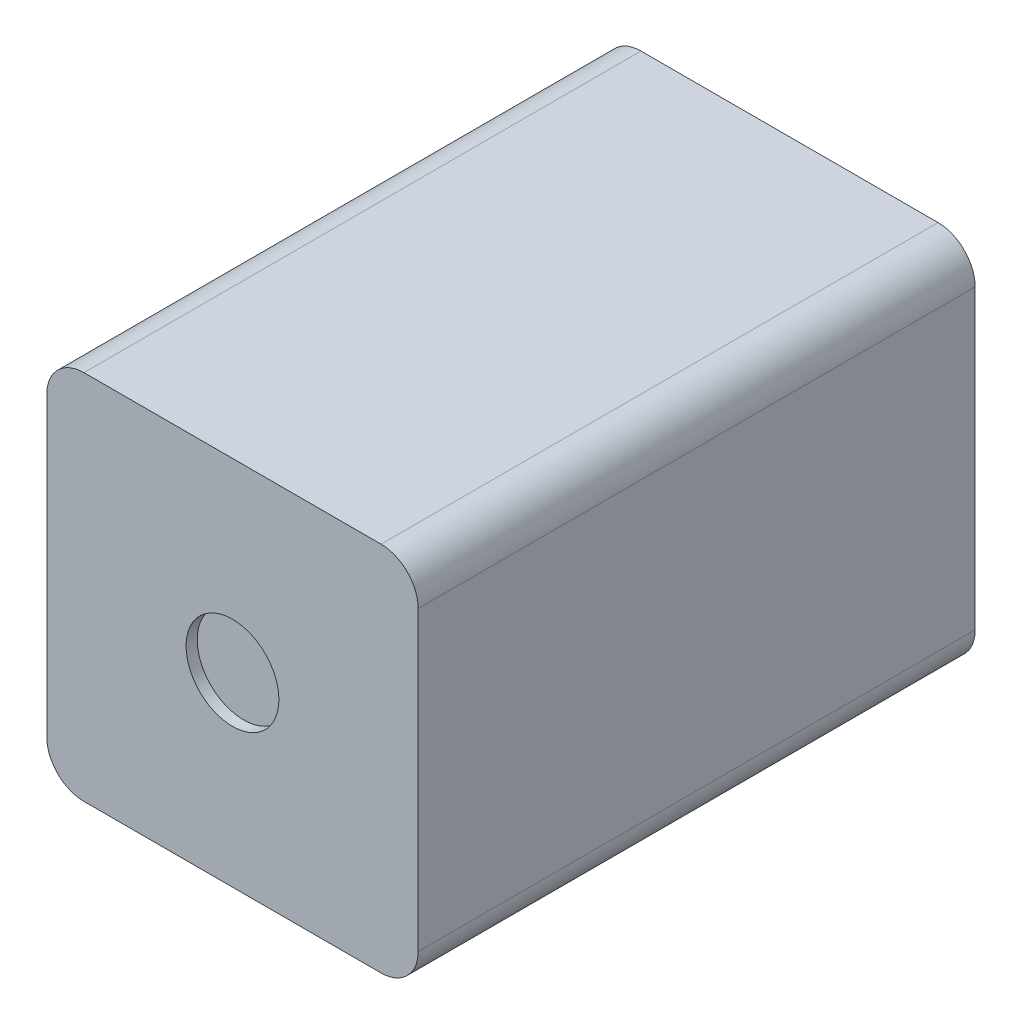
ISO-10303-21;
HEADER;
FILE_DESCRIPTION(('STEP AP214'),'2;1');
FILE_NAME('part.step','',(''),(''),'','','');
FILE_SCHEMA(('AUTOMOTIVE_DESIGN { 1 0 10303 214 1 1 1 1 }'));
ENDSEC;
DATA;
#1=APPLICATION_CONTEXT('core data for automotive mechanical design processes');
#2=APPLICATION_PROTOCOL_DEFINITION('international standard','automotive_design',2000,#1);
#3=PRODUCT_CONTEXT('',#1,'mechanical');
#4=PRODUCT('Part','Part','',(#3));
#5=PRODUCT_RELATED_PRODUCT_CATEGORY('part','',(#4));
#6=PRODUCT_DEFINITION_FORMATION('','',#4);
#7=PRODUCT_DEFINITION_CONTEXT('part definition',#1,'design');
#8=PRODUCT_DEFINITION('design','',#6,#7);
#9=PRODUCT_DEFINITION_SHAPE('','',#8);
#10=(LENGTH_UNIT() NAMED_UNIT(*) SI_UNIT(.MILLI.,.METRE.));
#11=(NAMED_UNIT(*) PLANE_ANGLE_UNIT() SI_UNIT($,.RADIAN.));
#12=(NAMED_UNIT(*) SI_UNIT($,.STERADIAN.) SOLID_ANGLE_UNIT());
#13=UNCERTAINTY_MEASURE_WITH_UNIT(LENGTH_MEASURE(1.E-05),#10,'distance_accuracy_value','');
#14=(GEOMETRIC_REPRESENTATION_CONTEXT(3) GLOBAL_UNCERTAINTY_ASSIGNED_CONTEXT((#13)) GLOBAL_UNIT_ASSIGNED_CONTEXT((#10,
#11,#12)) REPRESENTATION_CONTEXT('',''));
#15=CARTESIAN_POINT('',(0.,0.,0.));
#16=DIRECTION('',(0.,0.,1.));
#17=DIRECTION('',(1.,0.,0.));
#18=AXIS2_PLACEMENT_3D('',#15,#16,#17);
#19=CARTESIAN_POINT('',(0.,0.,38.1));
#20=DIRECTION('',(-1.,0.,0.));
#21=DIRECTION('',(0.,-1.,0.));
#22=AXIS2_PLACEMENT_3D('',#19,#20,#21);
#23=PLANE('',#22);
#24=DIRECTION('',(0.,1.,0.));
#25=VECTOR('',#24,1.);
#26=CARTESIAN_POINT('',(0.,0.,38.1));
#27=LINE('',#26,#25);
#28=CARTESIAN_POINT('',(0.,-22.86,38.1));
#29=VERTEX_POINT('',#28);
#30=CARTESIAN_POINT('',(0.,-2.54,38.1));
#31=VERTEX_POINT('',#30);
#32=EDGE_CURVE('E136',#29,#31,#27,.T.);
#33=ORIENTED_EDGE('',*,*,#32,.F.);
#34=DIRECTION('',(0.,0.,-1.));
#35=VECTOR('',#34,1.);
#36=CARTESIAN_POINT('',(0.,-22.86,38.1));
#37=LINE('',#36,#35);
#38=CARTESIAN_POINT('',(0.,-22.86,0.));
#39=VERTEX_POINT('',#38);
#40=EDGE_CURVE('E121',#29,#39,#37,.T.);
#41=ORIENTED_EDGE('',*,*,#40,.T.);
#42=DIRECTION('',(0.,1.,0.));
#43=VECTOR('',#42,1.);
#44=CARTESIAN_POINT('',(0.,0.,0.));
#45=LINE('',#44,#43);
#46=CARTESIAN_POINT('',(0.,-2.54,0.));
#47=VERTEX_POINT('',#46);
#48=EDGE_CURVE('E133',#39,#47,#45,.T.);
#49=ORIENTED_EDGE('',*,*,#48,.T.);
#50=DIRECTION('',(0.,0.,-1.));
#51=VECTOR('',#50,1.);
#52=CARTESIAN_POINT('',(0.,-2.54,38.1));
#53=LINE('',#52,#51);
#54=EDGE_CURVE('E138',#47,#31,#53,.F.);
#55=ORIENTED_EDGE('',*,*,#54,.T.);
#56=EDGE_LOOP('',(#33,#41,#49,#55));
#57=FACE_BOUND('',#56,.T.);
#58=ADVANCED_FACE('F42',(#57),#23,.F.);
#59=CARTESIAN_POINT('',(0.,0.,38.1));
#60=DIRECTION('',(0.,-1.,0.));
#61=DIRECTION('',(1.,0.,0.));
#62=AXIS2_PLACEMENT_3D('',#59,#60,#61);
#63=PLANE('',#62);
#64=DIRECTION('',(-1.,0.,0.));
#65=VECTOR('',#64,1.);
#66=CARTESIAN_POINT('',(0.,0.,38.1));
#67=LINE('',#66,#65);
#68=CARTESIAN_POINT('',(-2.54,0.,38.1));
#69=VERTEX_POINT('',#68);
#70=CARTESIAN_POINT('',(-22.86,0.,38.1));
#71=VERTEX_POINT('',#70);
#72=EDGE_CURVE('E192',#69,#71,#67,.T.);
#73=ORIENTED_EDGE('',*,*,#72,.F.);
#74=DIRECTION('',(0.,0.,-1.));
#75=VECTOR('',#74,1.);
#76=CARTESIAN_POINT('',(-2.54,0.,38.1));
#77=LINE('',#76,#75);
#78=CARTESIAN_POINT('',(-2.54,0.,0.));
#79=VERTEX_POINT('',#78);
#80=EDGE_CURVE('E11',#69,#79,#77,.T.);
#81=ORIENTED_EDGE('',*,*,#80,.T.);
#82=DIRECTION('',(-1.,0.,0.));
#83=VECTOR('',#82,1.);
#84=CARTESIAN_POINT('',(0.,0.,0.));
#85=LINE('',#84,#83);
#86=CARTESIAN_POINT('',(-22.86,0.,0.));
#87=VERTEX_POINT('',#86);
#88=EDGE_CURVE('E143',#79,#87,#85,.T.);
#89=ORIENTED_EDGE('',*,*,#88,.T.);
#90=DIRECTION('',(0.,0.,-1.));
#91=VECTOR('',#90,1.);
#92=CARTESIAN_POINT('',(-22.86,0.,38.1));
#93=LINE('',#92,#91);
#94=EDGE_CURVE('E50',#87,#71,#93,.F.);
#95=ORIENTED_EDGE('',*,*,#94,.T.);
#96=EDGE_LOOP('',(#73,#81,#89,#95));
#97=FACE_BOUND('',#96,.T.);
#98=ADVANCED_FACE('F191',(#97),#63,.F.);
#99=CARTESIAN_POINT('',(-25.4,0.,38.1));
#100=DIRECTION('',(1.,0.,0.));
#101=DIRECTION('',(0.,1.,0.));
#102=AXIS2_PLACEMENT_3D('',#99,#100,#101);
#103=PLANE('',#102);
#104=DIRECTION('',(0.,-1.,0.));
#105=VECTOR('',#104,1.);
#106=CARTESIAN_POINT('',(-25.4,0.,0.));
#107=LINE('',#106,#105);
#108=CARTESIAN_POINT('',(-25.4,-2.54,0.));
#109=VERTEX_POINT('',#108);
#110=CARTESIAN_POINT('',(-25.4,-22.86,0.));
#111=VERTEX_POINT('',#110);
#112=EDGE_CURVE('E148',#109,#111,#107,.T.);
#113=ORIENTED_EDGE('',*,*,#112,.T.);
#114=DIRECTION('',(0.,0.,-1.));
#115=VECTOR('',#114,1.);
#116=CARTESIAN_POINT('',(-25.4,-22.86,38.1));
#117=LINE('',#116,#115);
#118=CARTESIAN_POINT('',(-25.4,-22.86,38.1));
#119=VERTEX_POINT('',#118);
#120=EDGE_CURVE('E60',#111,#119,#117,.F.);
#121=ORIENTED_EDGE('',*,*,#120,.T.);
#122=DIRECTION('',(0.,-1.,0.));
#123=VECTOR('',#122,1.);
#124=CARTESIAN_POINT('',(-25.4,0.,38.1));
#125=LINE('',#124,#123);
#126=CARTESIAN_POINT('',(-25.4,-2.54,38.1));
#127=VERTEX_POINT('',#126);
#128=EDGE_CURVE('E199',#127,#119,#125,.T.);
#129=ORIENTED_EDGE('',*,*,#128,.F.);
#130=DIRECTION('',(0.,0.,-1.));
#131=VECTOR('',#130,1.);
#132=CARTESIAN_POINT('',(-25.4,-2.54,38.1));
#133=LINE('',#132,#131);
#134=EDGE_CURVE('E182',#127,#109,#133,.T.);
#135=ORIENTED_EDGE('',*,*,#134,.T.);
#136=EDGE_LOOP('',(#113,#121,#129,#135));
#137=FACE_BOUND('',#136,.T.);
#138=ADVANCED_FACE('F203',(#137),#103,.F.);
#139=CARTESIAN_POINT('',(0.,-25.4,38.1));
#140=DIRECTION('',(0.,1.,0.));
#141=DIRECTION('',(-1.,0.,0.));
#142=AXIS2_PLACEMENT_3D('',#139,#140,#141);
#143=PLANE('',#142);
#144=DIRECTION('',(1.,0.,0.));
#145=VECTOR('',#144,1.);
#146=CARTESIAN_POINT('',(0.,-25.4,0.));
#147=LINE('',#146,#145);
#148=CARTESIAN_POINT('',(-22.86,-25.4,0.));
#149=VERTEX_POINT('',#148);
#150=CARTESIAN_POINT('',(-2.54,-25.4,0.));
#151=VERTEX_POINT('',#150);
#152=EDGE_CURVE('E160',#149,#151,#147,.T.);
#153=ORIENTED_EDGE('',*,*,#152,.T.);
#154=DIRECTION('',(0.,0.,-1.));
#155=VECTOR('',#154,1.);
#156=CARTESIAN_POINT('',(-2.54,-25.4,38.1));
#157=LINE('',#156,#155);
#158=CARTESIAN_POINT('',(-2.54,-25.4,38.1));
#159=VERTEX_POINT('',#158);
#160=EDGE_CURVE('E122',#151,#159,#157,.F.);
#161=ORIENTED_EDGE('',*,*,#160,.T.);
#162=DIRECTION('',(1.,0.,0.));
#163=VECTOR('',#162,1.);
#164=CARTESIAN_POINT('',(0.,-25.4,38.1));
#165=LINE('',#164,#163);
#166=CARTESIAN_POINT('',(-22.86,-25.4,38.1));
#167=VERTEX_POINT('',#166);
#168=EDGE_CURVE('E155',#167,#159,#165,.T.);
#169=ORIENTED_EDGE('',*,*,#168,.F.);
#170=DIRECTION('',(0.,0.,-1.));
#171=VECTOR('',#170,1.);
#172=CARTESIAN_POINT('',(-22.86,-25.4,38.1));
#173=LINE('',#172,#171);
#174=EDGE_CURVE('E127',#167,#149,#173,.T.);
#175=ORIENTED_EDGE('',*,*,#174,.T.);
#176=EDGE_LOOP('',(#153,#161,#169,#175));
#177=FACE_BOUND('',#176,.T.);
#178=ADVANCED_FACE('F210',(#177),#143,.F.);
#179=CARTESIAN_POINT('',(0.,0.,38.1));
#180=DIRECTION('',(0.,0.,-1.));
#181=DIRECTION('',(-1.,0.,0.));
#182=AXIS2_PLACEMENT_3D('',#179,#180,#181);
#183=PLANE('',#182);
#184=CARTESIAN_POINT('',(-12.7,-12.7,38.1));
#185=DIRECTION('',(0.,0.,1.));
#186=DIRECTION('',(1.,0.,0.));
#187=AXIS2_PLACEMENT_3D('',#184,#185,#186);
#188=CIRCLE('',#187,3.175);
#189=CARTESIAN_POINT('',(-9.525,-12.7,38.1));
#190=VERTEX_POINT('',#189);
#191=EDGE_CURVE('E152',#190,#190,#188,.T.);
#192=ORIENTED_EDGE('',*,*,#191,.F.);
#193=EDGE_LOOP('',(#192));
#194=FACE_BOUND('',#193,.T.);
#195=ORIENTED_EDGE('',*,*,#168,.T.);
#196=CARTESIAN_POINT('',(-2.54,-22.86,38.1));
#197=DIRECTION('',(0.,0.,-1.));
#198=DIRECTION('',(-1.,0.,0.));
#199=AXIS2_PLACEMENT_3D('',#196,#197,#198);
#200=CIRCLE('',#199,2.54);
#201=EDGE_CURVE('E180',#159,#29,#200,.F.);
#202=ORIENTED_EDGE('',*,*,#201,.T.);
#203=ORIENTED_EDGE('',*,*,#32,.T.);
#204=CARTESIAN_POINT('',(-2.54,-2.54,38.1));
#205=DIRECTION('',(0.,0.,-1.));
#206=DIRECTION('',(-1.,0.,0.));
#207=AXIS2_PLACEMENT_3D('',#204,#205,#206);
#208=CIRCLE('',#207,2.54);
#209=EDGE_CURVE('E175',#31,#69,#208,.F.);
#210=ORIENTED_EDGE('',*,*,#209,.T.);
#211=ORIENTED_EDGE('',*,*,#72,.T.);
#212=CARTESIAN_POINT('',(-22.86,-2.54,38.1));
#213=DIRECTION('',(0.,0.,-1.));
#214=DIRECTION('',(-1.,0.,0.));
#215=AXIS2_PLACEMENT_3D('',#212,#213,#214);
#216=CIRCLE('',#215,2.54);
#217=EDGE_CURVE('E68',#71,#127,#216,.F.);
#218=ORIENTED_EDGE('',*,*,#217,.T.);
#219=ORIENTED_EDGE('',*,*,#128,.T.);
#220=CARTESIAN_POINT('',(-22.86,-22.86,38.1));
#221=DIRECTION('',(0.,0.,-1.));
#222=DIRECTION('',(-1.,0.,0.));
#223=AXIS2_PLACEMENT_3D('',#220,#221,#222);
#224=CIRCLE('',#223,2.54);
#225=EDGE_CURVE('E177',#119,#167,#224,.F.);
#226=ORIENTED_EDGE('',*,*,#225,.T.);
#227=EDGE_LOOP('',(#195,#202,#203,#210,#211,#218,#219,#226));
#228=FACE_BOUND('',#227,.T.);
#229=ADVANCED_FACE('F196',(#194,#228),#183,.F.);
#230=CARTESIAN_POINT('',(0.,0.,0.));
#231=DIRECTION('',(0.,0.,-1.));
#232=DIRECTION('',(-1.,0.,0.));
#233=AXIS2_PLACEMENT_3D('',#230,#231,#232);
#234=PLANE('',#233);
#235=CARTESIAN_POINT('',(-12.7,-12.7,0.));
#236=DIRECTION('',(0.,0.,-1.));
#237=DIRECTION('',(-1.,0.,0.));
#238=AXIS2_PLACEMENT_3D('',#235,#236,#237);
#239=CIRCLE('',#238,3.175);
#240=CARTESIAN_POINT('',(-15.875,-12.7,0.));
#241=VERTEX_POINT('',#240);
#242=EDGE_CURVE('E219',#241,#241,#239,.T.);
#243=ORIENTED_EDGE('',*,*,#242,.F.);
#244=EDGE_LOOP('',(#243));
#245=FACE_BOUND('',#244,.T.);
#246=ORIENTED_EDGE('',*,*,#48,.F.);
#247=CARTESIAN_POINT('',(-2.54,-22.86,0.));
#248=DIRECTION('',(0.,0.,-1.));
#249=DIRECTION('',(-1.,0.,0.));
#250=AXIS2_PLACEMENT_3D('',#247,#248,#249);
#251=CIRCLE('',#250,2.54);
#252=EDGE_CURVE('E117',#39,#151,#251,.T.);
#253=ORIENTED_EDGE('',*,*,#252,.T.);
#254=ORIENTED_EDGE('',*,*,#152,.F.);
#255=CARTESIAN_POINT('',(-22.86,-22.86,0.));
#256=DIRECTION('',(0.,0.,-1.));
#257=DIRECTION('',(-1.,0.,0.));
#258=AXIS2_PLACEMENT_3D('',#255,#256,#257);
#259=CIRCLE('',#258,2.54);
#260=EDGE_CURVE('E128',#149,#111,#259,.T.);
#261=ORIENTED_EDGE('',*,*,#260,.T.);
#262=ORIENTED_EDGE('',*,*,#112,.F.);
#263=CARTESIAN_POINT('',(-22.86,-2.54,0.));
#264=DIRECTION('',(0.,0.,-1.));
#265=DIRECTION('',(-1.,0.,0.));
#266=AXIS2_PLACEMENT_3D('',#263,#264,#265);
#267=CIRCLE('',#266,2.54);
#268=EDGE_CURVE('E137',#109,#87,#267,.T.);
#269=ORIENTED_EDGE('',*,*,#268,.T.);
#270=ORIENTED_EDGE('',*,*,#88,.F.);
#271=CARTESIAN_POINT('',(-2.54,-2.54,0.));
#272=DIRECTION('',(0.,0.,-1.));
#273=DIRECTION('',(-1.,0.,0.));
#274=AXIS2_PLACEMENT_3D('',#271,#272,#273);
#275=CIRCLE('',#274,2.54);
#276=EDGE_CURVE('E142',#79,#47,#275,.T.);
#277=ORIENTED_EDGE('',*,*,#276,.T.);
#278=EDGE_LOOP('',(#246,#253,#254,#261,#262,#269,#270,#277));
#279=FACE_BOUND('',#278,.T.);
#280=ADVANCED_FACE('F140',(#245,#279),#234,.T.);
#281=CARTESIAN_POINT('',(-2.54,-22.86,38.1));
#282=DIRECTION('',(0.,0.,-1.));
#283=DIRECTION('',(-1.,0.,0.));
#284=AXIS2_PLACEMENT_3D('',#281,#282,#283);
#285=CYLINDRICAL_SURFACE('',#284,2.54);
#286=ORIENTED_EDGE('',*,*,#201,.F.);
#287=ORIENTED_EDGE('',*,*,#160,.F.);
#288=ORIENTED_EDGE('',*,*,#252,.F.);
#289=ORIENTED_EDGE('',*,*,#40,.F.);
#290=EDGE_LOOP('',(#286,#287,#288,#289));
#291=FACE_BOUND('',#290,.T.);
#292=ADVANCED_FACE('F120',(#291),#285,.T.);
#293=CARTESIAN_POINT('',(-22.86,-22.86,38.1));
#294=DIRECTION('',(0.,0.,-1.));
#295=DIRECTION('',(-1.,0.,0.));
#296=AXIS2_PLACEMENT_3D('',#293,#294,#295);
#297=CYLINDRICAL_SURFACE('',#296,2.54);
#298=ORIENTED_EDGE('',*,*,#225,.F.);
#299=ORIENTED_EDGE('',*,*,#120,.F.);
#300=ORIENTED_EDGE('',*,*,#260,.F.);
#301=ORIENTED_EDGE('',*,*,#174,.F.);
#302=EDGE_LOOP('',(#298,#299,#300,#301));
#303=FACE_BOUND('',#302,.T.);
#304=ADVANCED_FACE('F207',(#303),#297,.T.);
#305=CARTESIAN_POINT('',(-2.54,-2.54,38.1));
#306=DIRECTION('',(0.,0.,-1.));
#307=DIRECTION('',(-1.,0.,0.));
#308=AXIS2_PLACEMENT_3D('',#305,#306,#307);
#309=CYLINDRICAL_SURFACE('',#308,2.54);
#310=ORIENTED_EDGE('',*,*,#209,.F.);
#311=ORIENTED_EDGE('',*,*,#54,.F.);
#312=ORIENTED_EDGE('',*,*,#276,.F.);
#313=ORIENTED_EDGE('',*,*,#80,.F.);
#314=EDGE_LOOP('',(#310,#311,#312,#313));
#315=FACE_BOUND('',#314,.T.);
#316=ADVANCED_FACE('F255',(#315),#309,.T.);
#317=CARTESIAN_POINT('',(-22.86,-2.54,38.1));
#318=DIRECTION('',(0.,0.,-1.));
#319=DIRECTION('',(-1.,0.,0.));
#320=AXIS2_PLACEMENT_3D('',#317,#318,#319);
#321=CYLINDRICAL_SURFACE('',#320,2.54);
#322=ORIENTED_EDGE('',*,*,#217,.F.);
#323=ORIENTED_EDGE('',*,*,#94,.F.);
#324=ORIENTED_EDGE('',*,*,#268,.F.);
#325=ORIENTED_EDGE('',*,*,#134,.F.);
#326=EDGE_LOOP('',(#322,#323,#324,#325));
#327=FACE_BOUND('',#326,.T.);
#328=ADVANCED_FACE('F44',(#327),#321,.T.);
#329=CARTESIAN_POINT('',(-12.7,-12.7,37.338));
#330=DIRECTION('',(0.,0.,1.));
#331=DIRECTION('',(1.,0.,0.));
#332=AXIS2_PLACEMENT_3D('',#329,#330,#331);
#333=CYLINDRICAL_SURFACE('',#332,3.175);
#334=CARTESIAN_POINT('',(-12.7,-12.7,37.338));
#335=DIRECTION('',(0.,0.,1.));
#336=DIRECTION('',(1.,0.,0.));
#337=AXIS2_PLACEMENT_3D('',#334,#335,#336);
#338=CIRCLE('',#337,3.175);
#339=CARTESIAN_POINT('',(-9.525,-12.7,37.338));
#340=VERTEX_POINT('',#339);
#341=EDGE_CURVE('E144',#340,#340,#338,.T.);
#342=CARTESIAN_POINT('',(-9.525,-12.7,37.338));
#343=CARTESIAN_POINT('',(-9.525,-12.7,37.3459375));
#344=CARTESIAN_POINT('',(-9.525,-12.7,37.353875));
#345=CARTESIAN_POINT('',(-9.525,-12.7,37.36975));
#346=CARTESIAN_POINT('',(-9.525,-12.7,37.3776875));
#347=CARTESIAN_POINT('',(-9.525,-12.7,37.3935625));
#348=CARTESIAN_POINT('',(-9.525,-12.7,37.4015));
#349=CARTESIAN_POINT('',(-9.525,-12.7,37.417375));
#350=CARTESIAN_POINT('',(-9.525,-12.7,37.4253125));
#351=CARTESIAN_POINT('',(-9.525,-12.7,37.4411875));
#352=CARTESIAN_POINT('',(-9.525,-12.7,37.449125));
#353=CARTESIAN_POINT('',(-9.525,-12.7,37.465));
#354=CARTESIAN_POINT('',(-9.525,-12.7,37.4729375));
#355=CARTESIAN_POINT('',(-9.525,-12.7,37.4888125));
#356=CARTESIAN_POINT('',(-9.525,-12.7,37.49675));
#357=CARTESIAN_POINT('',(-9.525,-12.7,37.512625));
#358=CARTESIAN_POINT('',(-9.525,-12.7,37.5205625));
#359=CARTESIAN_POINT('',(-9.525,-12.7,37.5364375));
#360=CARTESIAN_POINT('',(-9.525,-12.7,37.544375));
#361=CARTESIAN_POINT('',(-9.525,-12.7,37.56025));
#362=CARTESIAN_POINT('',(-9.525,-12.7,37.5681875));
#363=CARTESIAN_POINT('',(-9.525,-12.7,37.5840625));
#364=CARTESIAN_POINT('',(-9.525,-12.7,37.592));
#365=CARTESIAN_POINT('',(-9.525,-12.7,37.607875));
#366=CARTESIAN_POINT('',(-9.525,-12.7,37.6158125));
#367=CARTESIAN_POINT('',(-9.525,-12.7,37.6316875));
#368=CARTESIAN_POINT('',(-9.525,-12.7,37.639625));
#369=CARTESIAN_POINT('',(-9.525,-12.7,37.6555));
#370=CARTESIAN_POINT('',(-9.525,-12.7,37.6634375));
#371=CARTESIAN_POINT('',(-9.525,-12.7,37.6793125));
#372=CARTESIAN_POINT('',(-9.525,-12.7,37.68725));
#373=CARTESIAN_POINT('',(-9.525,-12.7,37.703125));
#374=CARTESIAN_POINT('',(-9.525,-12.7,37.7110625));
#375=CARTESIAN_POINT('',(-9.525,-12.7,37.7269375));
#376=CARTESIAN_POINT('',(-9.525,-12.7,37.734875));
#377=CARTESIAN_POINT('',(-9.525,-12.7,37.75075));
#378=CARTESIAN_POINT('',(-9.525,-12.7,37.7586875));
#379=CARTESIAN_POINT('',(-9.525,-12.7,37.7745625));
#380=CARTESIAN_POINT('',(-9.525,-12.7,37.7825));
#381=CARTESIAN_POINT('',(-9.525,-12.7,37.798375));
#382=CARTESIAN_POINT('',(-9.525,-12.7,37.8063125));
#383=CARTESIAN_POINT('',(-9.525,-12.7,37.8221875));
#384=CARTESIAN_POINT('',(-9.525,-12.7,37.830125));
#385=CARTESIAN_POINT('',(-9.525,-12.7,37.846));
#386=CARTESIAN_POINT('',(-9.525,-12.7,37.8539375));
#387=CARTESIAN_POINT('',(-9.525,-12.7,37.8698125));
#388=CARTESIAN_POINT('',(-9.525,-12.7,37.87775));
#389=CARTESIAN_POINT('',(-9.525,-12.7,37.893625));
#390=CARTESIAN_POINT('',(-9.525,-12.7,37.9015625));
#391=CARTESIAN_POINT('',(-9.525,-12.7,37.9174375));
#392=CARTESIAN_POINT('',(-9.525,-12.7,37.925375));
#393=CARTESIAN_POINT('',(-9.525,-12.7,37.94125));
#394=CARTESIAN_POINT('',(-9.525,-12.7,37.9491875));
#395=CARTESIAN_POINT('',(-9.525,-12.7,37.9650625));
#396=CARTESIAN_POINT('',(-9.525,-12.7,37.973));
#397=CARTESIAN_POINT('',(-9.525,-12.7,37.988875));
#398=CARTESIAN_POINT('',(-9.525,-12.7,37.9968125));
#399=CARTESIAN_POINT('',(-9.525,-12.7,38.0126875));
#400=CARTESIAN_POINT('',(-9.525,-12.7,38.020625));
#401=CARTESIAN_POINT('',(-9.525,-12.7,38.0365));
#402=CARTESIAN_POINT('',(-9.525,-12.7,38.0444375));
#403=CARTESIAN_POINT('',(-9.525,-12.7,38.0603125));
#404=CARTESIAN_POINT('',(-9.525,-12.7,38.06825));
#405=CARTESIAN_POINT('',(-9.525,-12.7,38.084125));
#406=CARTESIAN_POINT('',(-9.525,-12.7,38.0920625));
#407=CARTESIAN_POINT('',(-9.525,-12.7,38.1));
#408=B_SPLINE_CURVE_WITH_KNOTS('',3,(#342,#343,#344,#345,#346,#347,#348,#349,#350,#351,#352,
#353,#354,#355,#356,#357,#358,#359,#360,#361,#362,#363,#364,#365,#366,#367,#368,#369,#370,#371,
#372,#373,#374,#375,#376,#377,#378,#379,#380,#381,#382,#383,#384,#385,#386,#387,#388,#389,#390,
#391,#392,#393,#394,#395,#396,#397,#398,#399,#400,#401,#402,#403,#404,#405,#406,#407),
.UNSPECIFIED.,.F.,.F.,(4,2,2,2,2,2,2,2,2,2,2,2,2,2,2,2,2,2,2,2,2,2,2,2,2,2,2,2,2,2,2,2,4),(0.,
0.0238125000000047,0.0476250000000025,0.0714375000000003,0.0952500000000051,0.119062500000003,
0.142875000000001,0.166687500000005,0.190500000000003,0.214312500000001,0.238125000000006,
0.261937500000003,0.285750000000001,0.309562500000006,0.333375000000004,0.357187500000002,
0.381000000000006,0.404812500000004,0.428625000000002,0.4524375,0.476250000000004,
0.500062500000002,0.523875,0.547687500000005,0.571500000000003,0.5953125,0.619125000000005,
0.642937500000003,0.666750000000001,0.690562500000005,0.714375000000003,0.738187500000001,
0.762000000000006),.UNSPECIFIED.);
#409=EDGE_CURVE('BSEAM261',#340,#190,#408,.T.);
#410=ORIENTED_EDGE('',*,*,#341,.F.);
#411=ORIENTED_EDGE('',*,*,#191,.T.);
#412=ORIENTED_EDGE('',*,*,#409,.T.);
#413=ORIENTED_EDGE('',*,*,#409,.F.);
#414=EDGE_LOOP('',(#410,#412,#411,#413));
#415=FACE_BOUND('',#414,.T.);
#416=ADVANCED_FACE('F261',(#415),#333,.F.);
#417=CARTESIAN_POINT('',(-12.7,-12.7,37.338));
#418=DIRECTION('',(0.,0.,1.));
#419=DIRECTION('',(1.,0.,0.));
#420=AXIS2_PLACEMENT_3D('',#417,#418,#419);
#421=PLANE('',#420);
#422=ORIENTED_EDGE('',*,*,#341,.T.);
#423=EDGE_LOOP('',(#422));
#424=FACE_BOUND('',#423,.T.);
#425=ADVANCED_FACE('F232',(#424),#421,.T.);
#426=CARTESIAN_POINT('',(-12.7,-12.7,0.762));
#427=DIRECTION('',(0.,0.,-1.));
#428=DIRECTION('',(-1.,0.,0.));
#429=AXIS2_PLACEMENT_3D('',#426,#427,#428);
#430=CYLINDRICAL_SURFACE('',#429,3.175);
#431=CARTESIAN_POINT('',(-12.7,-12.7,0.762));
#432=DIRECTION('',(0.,0.,-1.));
#433=DIRECTION('',(-1.,0.,0.));
#434=AXIS2_PLACEMENT_3D('',#431,#432,#433);
#435=CIRCLE('',#434,3.175);
#436=CARTESIAN_POINT('',(-15.875,-12.7,0.762));
#437=VERTEX_POINT('',#436);
#438=EDGE_CURVE('E217',#437,#437,#435,.T.);
#439=CARTESIAN_POINT('',(-15.875,-12.7,0.762));
#440=CARTESIAN_POINT('',(-15.875,-12.7,0.7540625));
#441=CARTESIAN_POINT('',(-15.875,-12.7,0.746125));
#442=CARTESIAN_POINT('',(-15.875,-12.7,0.73025));
#443=CARTESIAN_POINT('',(-15.875,-12.7,0.7223125));
#444=CARTESIAN_POINT('',(-15.875,-12.7,0.7064375));
#445=CARTESIAN_POINT('',(-15.875,-12.7,0.6985));
#446=CARTESIAN_POINT('',(-15.875,-12.7,0.682625));
#447=CARTESIAN_POINT('',(-15.875,-12.7,0.6746875));
#448=CARTESIAN_POINT('',(-15.875,-12.7,0.6588125));
#449=CARTESIAN_POINT('',(-15.875,-12.7,0.650875));
#450=CARTESIAN_POINT('',(-15.875,-12.7,0.635));
#451=CARTESIAN_POINT('',(-15.875,-12.7,0.6270625));
#452=CARTESIAN_POINT('',(-15.875,-12.7,0.6111875));
#453=CARTESIAN_POINT('',(-15.875,-12.7,0.60325));
#454=CARTESIAN_POINT('',(-15.875,-12.7,0.587375));
#455=CARTESIAN_POINT('',(-15.875,-12.7,0.5794375));
#456=CARTESIAN_POINT('',(-15.875,-12.7,0.5635625));
#457=CARTESIAN_POINT('',(-15.875,-12.7,0.555625));
#458=CARTESIAN_POINT('',(-15.875,-12.7,0.53975));
#459=CARTESIAN_POINT('',(-15.875,-12.7,0.5318125));
#460=CARTESIAN_POINT('',(-15.875,-12.7,0.5159375));
#461=CARTESIAN_POINT('',(-15.875,-12.7,0.508));
#462=CARTESIAN_POINT('',(-15.875,-12.7,0.492125));
#463=CARTESIAN_POINT('',(-15.875,-12.7,0.4841875));
#464=CARTESIAN_POINT('',(-15.875,-12.7,0.4683125));
#465=CARTESIAN_POINT('',(-15.875,-12.7,0.460375));
#466=CARTESIAN_POINT('',(-15.875,-12.7,0.4445));
#467=CARTESIAN_POINT('',(-15.875,-12.7,0.4365625));
#468=CARTESIAN_POINT('',(-15.875,-12.7,0.4206875));
#469=CARTESIAN_POINT('',(-15.875,-12.7,0.41275));
#470=CARTESIAN_POINT('',(-15.875,-12.7,0.396875));
#471=CARTESIAN_POINT('',(-15.875,-12.7,0.3889375));
#472=CARTESIAN_POINT('',(-15.875,-12.7,0.3730625));
#473=CARTESIAN_POINT('',(-15.875,-12.7,0.365125));
#474=CARTESIAN_POINT('',(-15.875,-12.7,0.34925));
#475=CARTESIAN_POINT('',(-15.875,-12.7,0.3413125));
#476=CARTESIAN_POINT('',(-15.875,-12.7,0.3254375));
#477=CARTESIAN_POINT('',(-15.875,-12.7,0.3175));
#478=CARTESIAN_POINT('',(-15.875,-12.7,0.301625));
#479=CARTESIAN_POINT('',(-15.875,-12.7,0.2936875));
#480=CARTESIAN_POINT('',(-15.875,-12.7,0.2778125));
#481=CARTESIAN_POINT('',(-15.875,-12.7,0.269875));
#482=CARTESIAN_POINT('',(-15.875,-12.7,0.254));
#483=CARTESIAN_POINT('',(-15.875,-12.7,0.2460625));
#484=CARTESIAN_POINT('',(-15.875,-12.7,0.2301875));
#485=CARTESIAN_POINT('',(-15.875,-12.7,0.22225));
#486=CARTESIAN_POINT('',(-15.875,-12.7,0.206375));
#487=CARTESIAN_POINT('',(-15.875,-12.7,0.1984375));
#488=CARTESIAN_POINT('',(-15.875,-12.7,0.1825625));
#489=CARTESIAN_POINT('',(-15.875,-12.7,0.174625));
#490=CARTESIAN_POINT('',(-15.875,-12.7,0.15875));
#491=CARTESIAN_POINT('',(-15.875,-12.7,0.1508125));
#492=CARTESIAN_POINT('',(-15.875,-12.7,0.1349375));
#493=CARTESIAN_POINT('',(-15.875,-12.7,0.127));
#494=CARTESIAN_POINT('',(-15.875,-12.7,0.111125));
#495=CARTESIAN_POINT('',(-15.875,-12.7,0.1031875));
#496=CARTESIAN_POINT('',(-15.875,-12.7,0.0873125));
#497=CARTESIAN_POINT('',(-15.875,-12.7,0.079375));
#498=CARTESIAN_POINT('',(-15.875,-12.7,0.0635));
#499=CARTESIAN_POINT('',(-15.875,-12.7,0.0555625));
#500=CARTESIAN_POINT('',(-15.875,-12.7,0.0396875));
#501=CARTESIAN_POINT('',(-15.875,-12.7,0.03175));
#502=CARTESIAN_POINT('',(-15.875,-12.7,0.015875));
#503=CARTESIAN_POINT('',(-15.875,-12.7,0.00793749999999999));
#504=CARTESIAN_POINT('',(-15.875,-12.7,0.));
#505=B_SPLINE_CURVE_WITH_KNOTS('',3,(#439,#440,#441,#442,#443,#444,#445,#446,#447,#448,#449,
#450,#451,#452,#453,#454,#455,#456,#457,#458,#459,#460,#461,#462,#463,#464,#465,#466,#467,#468,
#469,#470,#471,#472,#473,#474,#475,#476,#477,#478,#479,#480,#481,#482,#483,#484,#485,#486,#487,
#488,#489,#490,#491,#492,#493,#494,#495,#496,#497,#498,#499,#500,#501,#502,#503,#504),
.UNSPECIFIED.,.F.,.F.,(4,2,2,2,2,2,2,2,2,2,2,2,2,2,2,2,2,2,2,2,2,2,2,2,2,2,2,2,2,2,2,2,4),(0.,
0.0238125,0.0476249999999999,0.0714375,0.09525,0.1190625,0.142875,0.1666875,0.1905,0.2143125,
0.238125,0.2619375,0.28575,0.3095625,0.333375,0.3571875,0.381,0.4048125,0.428625,0.4524375,
0.47625,0.5000625,0.523875,0.5476875,0.5715,0.5953125,0.619125,0.6429375,0.66675,0.6905625,
0.714375,0.7381875,0.762),.UNSPECIFIED.);
#506=EDGE_CURVE('BSEAM229',#437,#241,#505,.T.);
#507=ORIENTED_EDGE('',*,*,#438,.F.);
#508=ORIENTED_EDGE('',*,*,#242,.T.);
#509=ORIENTED_EDGE('',*,*,#506,.T.);
#510=ORIENTED_EDGE('',*,*,#506,.F.);
#511=EDGE_LOOP('',(#507,#509,#508,#510));
#512=FACE_BOUND('',#511,.T.);
#513=ADVANCED_FACE('F229',(#512),#430,.F.);
#514=CARTESIAN_POINT('',(-12.7,-12.7,0.762));
#515=DIRECTION('',(0.,0.,-1.));
#516=DIRECTION('',(-1.,0.,0.));
#517=AXIS2_PLACEMENT_3D('',#514,#515,#516);
#518=PLANE('',#517);
#519=ORIENTED_EDGE('',*,*,#438,.T.);
#520=EDGE_LOOP('',(#519));
#521=FACE_BOUND('',#520,.T.);
#522=ADVANCED_FACE('F227',(#521),#518,.T.);
#523=CLOSED_SHELL('',(#58,#98,#138,#178,#229,#280,#292,#304,#316,#328,#416,#425,#513,#522));
#524=MANIFOLD_SOLID_BREP('B2',#523);
#525=ADVANCED_BREP_SHAPE_REPRESENTATION('',(#18,#524),#14);
#526=SHAPE_DEFINITION_REPRESENTATION(#9,#525);
ENDSEC;
END-ISO-10303-21;
